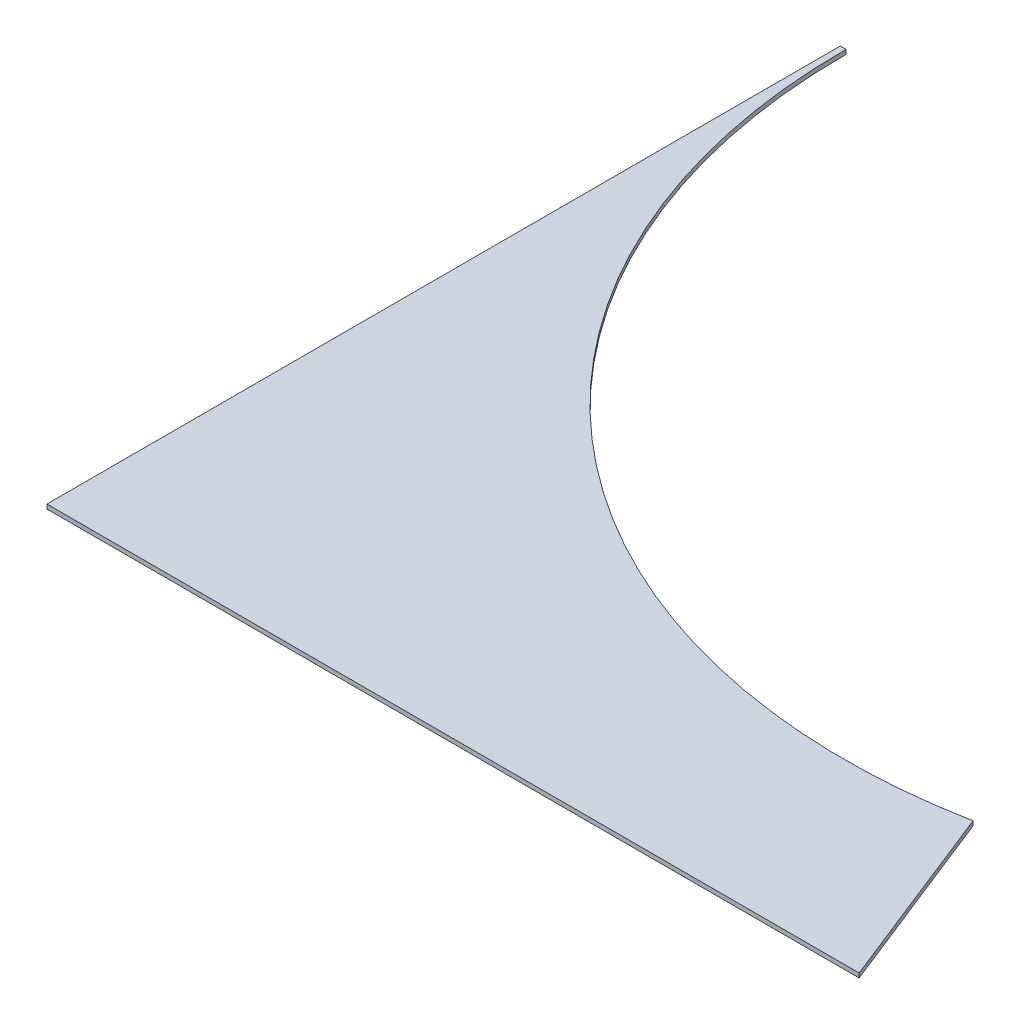
ISO-10303-21;
HEADER;
FILE_DESCRIPTION(('STEP AP214'),'2;1');
FILE_NAME('part.step','',(''),(''),'','','');
FILE_SCHEMA(('AUTOMOTIVE_DESIGN { 1 0 10303 214 1 1 1 1 }'));
ENDSEC;
DATA;
#1=APPLICATION_CONTEXT('core data for automotive mechanical design processes');
#2=APPLICATION_PROTOCOL_DEFINITION('international standard','automotive_design',2000,#1);
#3=PRODUCT_CONTEXT('',#1,'mechanical');
#4=PRODUCT('Part','Part','',(#3));
#5=PRODUCT_RELATED_PRODUCT_CATEGORY('part','',(#4));
#6=PRODUCT_DEFINITION_FORMATION('','',#4);
#7=PRODUCT_DEFINITION_CONTEXT('part definition',#1,'design');
#8=PRODUCT_DEFINITION('design','',#6,#7);
#9=PRODUCT_DEFINITION_SHAPE('','',#8);
#10=(LENGTH_UNIT() NAMED_UNIT(*) SI_UNIT(.MILLI.,.METRE.));
#11=(NAMED_UNIT(*) PLANE_ANGLE_UNIT() SI_UNIT($,.RADIAN.));
#12=(NAMED_UNIT(*) SI_UNIT($,.STERADIAN.) SOLID_ANGLE_UNIT());
#13=UNCERTAINTY_MEASURE_WITH_UNIT(LENGTH_MEASURE(1.E-05),#10,'distance_accuracy_value','');
#14=(GEOMETRIC_REPRESENTATION_CONTEXT(3) GLOBAL_UNCERTAINTY_ASSIGNED_CONTEXT((#13)) GLOBAL_UNIT_ASSIGNED_CONTEXT((#10,
#11,#12)) REPRESENTATION_CONTEXT('',''));
#15=CARTESIAN_POINT('',(0.,0.,0.));
#16=DIRECTION('',(0.,0.,1.));
#17=DIRECTION('',(1.,0.,0.));
#18=AXIS2_PLACEMENT_3D('',#15,#16,#17);
#19=CARTESIAN_POINT('',(200.094696146045,2.99999999999989,1.13984917284549));
#20=DIRECTION('',(0.,-1.,0.));
#21=DIRECTION('',(0.,0.,-1.));
#22=AXIS2_PLACEMENT_3D('',#19,#20,#21);
#23=CYLINDRICAL_SURFACE('',#22,423.5);
#24=CARTESIAN_POINT('',(200.094696146045,0.,1.13984917284549));
#25=DIRECTION('',(0.,-1.,0.));
#26=DIRECTION('',(0.,0.,1.));
#27=AXIS2_PLACEMENT_3D('',#24,#25,#26);
#28=CIRCLE('',#27,423.5);
#29=CARTESIAN_POINT('',(281.,0.,416.839959598979));
#30=VERTEX_POINT('',#29);
#31=CARTESIAN_POINT('',(-223.403769900602,0.,0.));
#32=VERTEX_POINT('',#31);
#33=EDGE_CURVE('E116',#30,#32,#28,.T.);
#34=ORIENTED_EDGE('',*,*,#33,.T.);
#35=DIRECTION('',(0.,-1.,0.));
#36=VECTOR('',#35,1.);
#37=CARTESIAN_POINT('',(-223.403769900602,2.99999999999989,0.));
#38=LINE('',#37,#36);
#39=CARTESIAN_POINT('',(-223.403769900602,2.99999999999989,0.));
#40=VERTEX_POINT('',#39);
#41=EDGE_CURVE('E11',#40,#32,#38,.T.);
#42=ORIENTED_EDGE('',*,*,#41,.F.);
#43=CARTESIAN_POINT('',(200.094696146045,2.99999999999989,1.13984917284549));
#44=DIRECTION('',(0.,-1.,0.));
#45=DIRECTION('',(0.,0.,1.));
#46=AXIS2_PLACEMENT_3D('',#43,#44,#45);
#47=CIRCLE('',#46,423.5);
#48=CARTESIAN_POINT('',(281.,2.99999999999989,416.839959598979));
#49=VERTEX_POINT('',#48);
#50=EDGE_CURVE('E129',#49,#40,#47,.T.);
#51=ORIENTED_EDGE('',*,*,#50,.F.);
#52=DIRECTION('',(0.,-1.,0.));
#53=VECTOR('',#52,1.);
#54=CARTESIAN_POINT('',(281.,2.99999999999989,416.839959598979));
#55=LINE('',#54,#53);
#56=EDGE_CURVE('E112',#49,#30,#55,.T.);
#57=ORIENTED_EDGE('',*,*,#56,.T.);
#58=EDGE_LOOP('',(#34,#42,#51,#57));
#59=FACE_BOUND('',#58,.T.);
#60=ADVANCED_FACE('F36',(#59),#23,.F.);
#61=CARTESIAN_POINT('',(-223.403769900602,2.99999999999989,0.));
#62=DIRECTION('',(0.,0.,1.));
#63=DIRECTION('',(1.,0.,0.));
#64=AXIS2_PLACEMENT_3D('',#61,#62,#63);
#65=PLANE('',#64);
#66=DIRECTION('',(-1.,0.,0.));
#67=VECTOR('',#66,1.);
#68=CARTESIAN_POINT('',(-223.403769900602,0.,0.));
#69=LINE('',#68,#67);
#70=CARTESIAN_POINT('',(-227.403769900602,0.,0.));
#71=VERTEX_POINT('',#70);
#72=EDGE_CURVE('E120',#32,#71,#69,.T.);
#73=ORIENTED_EDGE('',*,*,#72,.T.);
#74=DIRECTION('',(0.,-1.,0.));
#75=VECTOR('',#74,1.);
#76=CARTESIAN_POINT('',(-227.403769900602,2.99999999999989,0.));
#77=LINE('',#76,#75);
#78=CARTESIAN_POINT('',(-227.403769900602,2.99999999999989,0.));
#79=VERTEX_POINT('',#78);
#80=EDGE_CURVE('E45',#79,#71,#77,.T.);
#81=ORIENTED_EDGE('',*,*,#80,.F.);
#82=DIRECTION('',(-1.,0.,0.));
#83=VECTOR('',#82,1.);
#84=CARTESIAN_POINT('',(-223.403769900602,2.99999999999989,0.));
#85=LINE('',#84,#83);
#86=EDGE_CURVE('E87',#40,#79,#85,.T.);
#87=ORIENTED_EDGE('',*,*,#86,.F.);
#88=ORIENTED_EDGE('',*,*,#41,.T.);
#89=EDGE_LOOP('',(#73,#81,#87,#88));
#90=FACE_BOUND('',#89,.T.);
#91=ADVANCED_FACE('F152',(#90),#65,.F.);
#92=CARTESIAN_POINT('',(-227.403769900602,2.99999999999989,0.));
#93=DIRECTION('',(1.,0.,0.));
#94=DIRECTION('',(0.,0.,-1.));
#95=AXIS2_PLACEMENT_3D('',#92,#93,#94);
#96=PLANE('',#95);
#97=DIRECTION('',(0.,0.,1.));
#98=VECTOR('',#97,1.);
#99=CARTESIAN_POINT('',(-227.403769900602,0.,0.));
#100=LINE('',#99,#98);
#101=CARTESIAN_POINT('',(-227.403769900602,0.,546.985374575957));
#102=VERTEX_POINT('',#101);
#103=EDGE_CURVE('E103',#71,#102,#100,.T.);
#104=ORIENTED_EDGE('',*,*,#103,.T.);
#105=DIRECTION('',(0.,-1.,0.));
#106=VECTOR('',#105,1.);
#107=CARTESIAN_POINT('',(-227.403769900602,2.99999999999989,546.985374575957));
#108=LINE('',#107,#106);
#109=CARTESIAN_POINT('',(-227.403769900602,2.99999999999989,546.985374575957));
#110=VERTEX_POINT('',#109);
#111=EDGE_CURVE('E100',#110,#102,#108,.T.);
#112=ORIENTED_EDGE('',*,*,#111,.F.);
#113=DIRECTION('',(0.,0.,1.));
#114=VECTOR('',#113,1.);
#115=CARTESIAN_POINT('',(-227.403769900602,2.99999999999989,0.));
#116=LINE('',#115,#114);
#117=EDGE_CURVE('E91',#79,#110,#116,.T.);
#118=ORIENTED_EDGE('',*,*,#117,.F.);
#119=ORIENTED_EDGE('',*,*,#80,.T.);
#120=EDGE_LOOP('',(#104,#112,#118,#119));
#121=FACE_BOUND('',#120,.T.);
#122=ADVANCED_FACE('F101',(#121),#96,.F.);
#123=CARTESIAN_POINT('',(-227.403769900602,2.99999999999989,546.985374575957));
#124=DIRECTION('',(0.,0.,-1.));
#125=DIRECTION('',(-1.,0.,0.));
#126=AXIS2_PLACEMENT_3D('',#123,#124,#125);
#127=PLANE('',#126);
#128=DIRECTION('',(1.,0.,0.));
#129=VECTOR('',#128,1.);
#130=CARTESIAN_POINT('',(-227.403769900602,0.,546.985374575957));
#131=LINE('',#130,#129);
#132=CARTESIAN_POINT('',(332.596230099398,0.,546.985374575957));
#133=VERTEX_POINT('',#132);
#134=EDGE_CURVE('E73',#102,#133,#131,.T.);
#135=ORIENTED_EDGE('',*,*,#134,.T.);
#136=DIRECTION('',(0.,-1.,0.));
#137=VECTOR('',#136,1.);
#138=CARTESIAN_POINT('',(332.596230099398,2.99999999999989,546.985374575957));
#139=LINE('',#138,#137);
#140=CARTESIAN_POINT('',(332.596230099398,2.99999999999989,546.985374575957));
#141=VERTEX_POINT('',#140);
#142=EDGE_CURVE('E105',#141,#133,#139,.T.);
#143=ORIENTED_EDGE('',*,*,#142,.F.);
#144=DIRECTION('',(1.,0.,0.));
#145=VECTOR('',#144,1.);
#146=CARTESIAN_POINT('',(-227.403769900602,2.99999999999989,546.985374575957));
#147=LINE('',#146,#145);
#148=EDGE_CURVE('E95',#110,#141,#147,.T.);
#149=ORIENTED_EDGE('',*,*,#148,.F.);
#150=ORIENTED_EDGE('',*,*,#111,.T.);
#151=EDGE_LOOP('',(#135,#143,#149,#150));
#152=FACE_BOUND('',#151,.T.);
#153=ADVANCED_FACE('F107',(#152),#127,.F.);
#154=CARTESIAN_POINT('',(281.,2.99999999999989,416.839959598979));
#155=DIRECTION('',(-0.929610106978419,0.,0.368544500709986));
#156=DIRECTION('',(0.368544500709986,0.,0.929610106978419));
#157=AXIS2_PLACEMENT_3D('',#154,#155,#156);
#158=PLANE('',#157);
#159=DIRECTION('',(-0.368544500709986,0.,-0.929610106978419));
#160=VECTOR('',#159,1.);
#161=CARTESIAN_POINT('',(281.,0.,416.839959598979));
#162=LINE('',#161,#160);
#163=EDGE_CURVE('E79',#133,#30,#162,.T.);
#164=ORIENTED_EDGE('',*,*,#163,.T.);
#165=ORIENTED_EDGE('',*,*,#56,.F.);
#166=DIRECTION('',(-0.368544500709986,0.,-0.929610106978419));
#167=VECTOR('',#166,1.);
#168=CARTESIAN_POINT('',(281.,2.99999999999989,416.839959598979));
#169=LINE('',#168,#167);
#170=EDGE_CURVE('E53',#141,#49,#169,.T.);
#171=ORIENTED_EDGE('',*,*,#170,.F.);
#172=ORIENTED_EDGE('',*,*,#142,.T.);
#173=EDGE_LOOP('',(#164,#165,#171,#172));
#174=FACE_BOUND('',#173,.T.);
#175=ADVANCED_FACE('F141',(#174),#158,.F.);
#176=CARTESIAN_POINT('',(200.094696146045,2.99999999999989,1.13984917284549));
#177=DIRECTION('',(0.,1.,0.));
#178=DIRECTION('',(0.,0.,1.));
#179=AXIS2_PLACEMENT_3D('',#176,#177,#178);
#180=PLANE('',#179);
#181=ORIENTED_EDGE('',*,*,#50,.T.);
#182=ORIENTED_EDGE('',*,*,#86,.T.);
#183=ORIENTED_EDGE('',*,*,#117,.T.);
#184=ORIENTED_EDGE('',*,*,#148,.T.);
#185=ORIENTED_EDGE('',*,*,#170,.T.);
#186=EDGE_LOOP('',(#181,#182,#183,#184,#185));
#187=FACE_BOUND('',#186,.T.);
#188=ADVANCED_FACE('F93',(#187),#180,.T.);
#189=CARTESIAN_POINT('',(200.094696146045,0.,1.13984917284549));
#190=DIRECTION('',(0.,1.,0.));
#191=DIRECTION('',(0.,0.,1.));
#192=AXIS2_PLACEMENT_3D('',#189,#190,#191);
#193=PLANE('',#192);
#194=ORIENTED_EDGE('',*,*,#33,.F.);
#195=ORIENTED_EDGE('',*,*,#163,.F.);
#196=ORIENTED_EDGE('',*,*,#134,.F.);
#197=ORIENTED_EDGE('',*,*,#103,.F.);
#198=ORIENTED_EDGE('',*,*,#72,.F.);
#199=EDGE_LOOP('',(#194,#195,#196,#197,#198));
#200=FACE_BOUND('',#199,.T.);
#201=ADVANCED_FACE('F137',(#200),#193,.F.);
#202=CLOSED_SHELL('',(#60,#91,#122,#153,#175,#188,#201));
#203=MANIFOLD_SOLID_BREP('B2',#202);
#204=ADVANCED_BREP_SHAPE_REPRESENTATION('',(#18,#203),#14);
#205=SHAPE_DEFINITION_REPRESENTATION(#9,#204);
ENDSEC;
END-ISO-10303-21;
